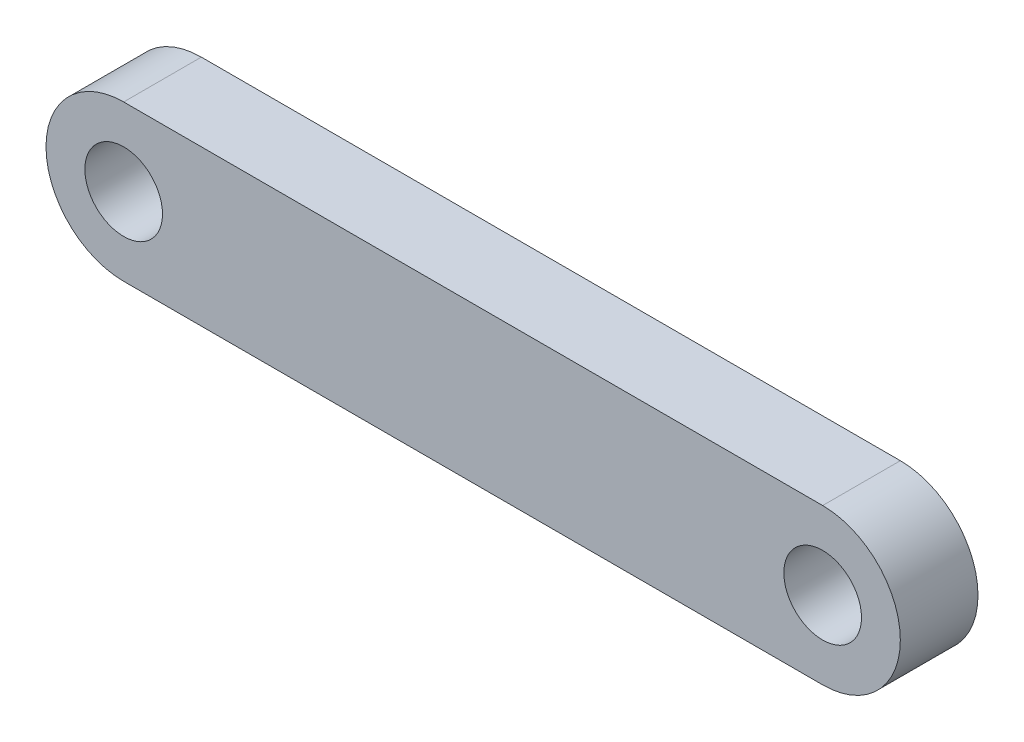
ISO-10303-21;
HEADER;
FILE_DESCRIPTION(('STEP AP214'),'2;1');
FILE_NAME('part.step','',(''),(''),'','','');
FILE_SCHEMA(('AUTOMOTIVE_DESIGN { 1 0 10303 214 1 1 1 1 }'));
ENDSEC;
DATA;
#1=APPLICATION_CONTEXT('core data for automotive mechanical design processes');
#2=APPLICATION_PROTOCOL_DEFINITION('international standard','automotive_design',2000,#1);
#3=PRODUCT_CONTEXT('',#1,'mechanical');
#4=PRODUCT('Part','Part','',(#3));
#5=PRODUCT_RELATED_PRODUCT_CATEGORY('part','',(#4));
#6=PRODUCT_DEFINITION_FORMATION('','',#4);
#7=PRODUCT_DEFINITION_CONTEXT('part definition',#1,'design');
#8=PRODUCT_DEFINITION('design','',#6,#7);
#9=PRODUCT_DEFINITION_SHAPE('','',#8);
#10=(LENGTH_UNIT() NAMED_UNIT(*) SI_UNIT(.MILLI.,.METRE.));
#11=(NAMED_UNIT(*) PLANE_ANGLE_UNIT() SI_UNIT($,.RADIAN.));
#12=(NAMED_UNIT(*) SI_UNIT($,.STERADIAN.) SOLID_ANGLE_UNIT());
#13=UNCERTAINTY_MEASURE_WITH_UNIT(LENGTH_MEASURE(1.E-05),#10,'distance_accuracy_value','');
#14=(GEOMETRIC_REPRESENTATION_CONTEXT(3) GLOBAL_UNCERTAINTY_ASSIGNED_CONTEXT((#13)) GLOBAL_UNIT_ASSIGNED_CONTEXT((#10,
#11,#12)) REPRESENTATION_CONTEXT('',''));
#15=CARTESIAN_POINT('',(0.,0.,0.));
#16=DIRECTION('',(0.,0.,1.));
#17=DIRECTION('',(1.,0.,0.));
#18=AXIS2_PLACEMENT_3D('',#15,#16,#17);
#19=CARTESIAN_POINT('',(-13.5,0.,3.));
#20=DIRECTION('',(0.,0.,1.));
#21=DIRECTION('',(1.,0.,0.));
#22=AXIS2_PLACEMENT_3D('',#19,#20,#21);
#23=PLANE('',#22);
#24=CARTESIAN_POINT('',(13.5,0.,3.));
#25=DIRECTION('',(0.,0.,1.));
#26=DIRECTION('',(1.,0.,0.));
#27=AXIS2_PLACEMENT_3D('',#24,#25,#26);
#28=CIRCLE('',#27,1.5);
#29=CARTESIAN_POINT('',(15.,0.,3.));
#30=VERTEX_POINT('',#29);
#31=EDGE_CURVE('E108',#30,#30,#28,.T.);
#32=ORIENTED_EDGE('',*,*,#31,.F.);
#33=EDGE_LOOP('',(#32));
#34=FACE_BOUND('',#33,.T.);
#35=CARTESIAN_POINT('',(-13.5,0.,3.));
#36=DIRECTION('',(0.,0.,1.));
#37=DIRECTION('',(1.,0.,0.));
#38=AXIS2_PLACEMENT_3D('',#35,#36,#37);
#39=CIRCLE('',#38,3.);
#40=CARTESIAN_POINT('',(-13.5,3.,3.));
#41=VERTEX_POINT('',#40);
#42=CARTESIAN_POINT('',(-13.5,-3.,3.));
#43=VERTEX_POINT('',#42);
#44=EDGE_CURVE('E93',#41,#43,#39,.T.);
#45=ORIENTED_EDGE('',*,*,#44,.T.);
#46=DIRECTION('',(1.,0.,0.));
#47=VECTOR('',#46,1.);
#48=CARTESIAN_POINT('',(-13.5,-3.,3.));
#49=LINE('',#48,#47);
#50=CARTESIAN_POINT('',(13.5,-3.,3.));
#51=VERTEX_POINT('',#50);
#52=EDGE_CURVE('E88',#43,#51,#49,.T.);
#53=ORIENTED_EDGE('',*,*,#52,.T.);
#54=CARTESIAN_POINT('',(13.5,0.,3.));
#55=DIRECTION('',(0.,0.,1.));
#56=DIRECTION('',(1.,0.,0.));
#57=AXIS2_PLACEMENT_3D('',#54,#55,#56);
#58=CIRCLE('',#57,3.);
#59=CARTESIAN_POINT('',(13.5,3.,3.));
#60=VERTEX_POINT('',#59);
#61=EDGE_CURVE('E91',#51,#60,#58,.T.);
#62=ORIENTED_EDGE('',*,*,#61,.T.);
#63=DIRECTION('',(-1.,0.,0.));
#64=VECTOR('',#63,1.);
#65=CARTESIAN_POINT('',(-13.5,3.,3.));
#66=LINE('',#65,#64);
#67=EDGE_CURVE('E58',#60,#41,#66,.T.);
#68=ORIENTED_EDGE('',*,*,#67,.T.);
#69=EDGE_LOOP('',(#45,#53,#62,#68));
#70=FACE_BOUND('',#69,.T.);
#71=CARTESIAN_POINT('',(-13.5,0.,3.));
#72=DIRECTION('',(0.,0.,1.));
#73=DIRECTION('',(1.,0.,0.));
#74=AXIS2_PLACEMENT_3D('',#71,#72,#73);
#75=CIRCLE('',#74,1.5);
#76=CARTESIAN_POINT('',(-12.,0.,3.));
#77=VERTEX_POINT('',#76);
#78=EDGE_CURVE('E123',#77,#77,#75,.T.);
#79=ORIENTED_EDGE('',*,*,#78,.F.);
#80=EDGE_LOOP('',(#79));
#81=FACE_BOUND('',#80,.T.);
#82=ADVANCED_FACE('F41',(#34,#70,#81),#23,.T.);
#83=CARTESIAN_POINT('',(-13.5,0.,0.));
#84=DIRECTION('',(0.,0.,1.));
#85=DIRECTION('',(1.,0.,0.));
#86=AXIS2_PLACEMENT_3D('',#83,#84,#85);
#87=PLANE('',#86);
#88=CARTESIAN_POINT('',(-13.5,0.,0.));
#89=DIRECTION('',(0.,0.,1.));
#90=DIRECTION('',(1.,0.,0.));
#91=AXIS2_PLACEMENT_3D('',#88,#89,#90);
#92=CIRCLE('',#91,3.);
#93=CARTESIAN_POINT('',(-13.5,3.,0.));
#94=VERTEX_POINT('',#93);
#95=CARTESIAN_POINT('',(-13.5,-3.,0.));
#96=VERTEX_POINT('',#95);
#97=EDGE_CURVE('E105',#94,#96,#92,.T.);
#98=ORIENTED_EDGE('',*,*,#97,.F.);
#99=DIRECTION('',(-1.,0.,0.));
#100=VECTOR('',#99,1.);
#101=CARTESIAN_POINT('',(-13.5,3.,0.));
#102=LINE('',#101,#100);
#103=CARTESIAN_POINT('',(13.5,3.,0.));
#104=VERTEX_POINT('',#103);
#105=EDGE_CURVE('E81',#104,#94,#102,.T.);
#106=ORIENTED_EDGE('',*,*,#105,.F.);
#107=CARTESIAN_POINT('',(13.5,0.,0.));
#108=DIRECTION('',(0.,0.,1.));
#109=DIRECTION('',(1.,0.,0.));
#110=AXIS2_PLACEMENT_3D('',#107,#108,#109);
#111=CIRCLE('',#110,3.);
#112=CARTESIAN_POINT('',(13.5,-3.,0.));
#113=VERTEX_POINT('',#112);
#114=EDGE_CURVE('E75',#113,#104,#111,.T.);
#115=ORIENTED_EDGE('',*,*,#114,.F.);
#116=DIRECTION('',(1.,0.,0.));
#117=VECTOR('',#116,1.);
#118=CARTESIAN_POINT('',(-13.5,-3.,0.));
#119=LINE('',#118,#117);
#120=EDGE_CURVE('E97',#96,#113,#119,.T.);
#121=ORIENTED_EDGE('',*,*,#120,.F.);
#122=EDGE_LOOP('',(#98,#106,#115,#121));
#123=FACE_BOUND('',#122,.T.);
#124=CARTESIAN_POINT('',(13.5,0.,0.));
#125=DIRECTION('',(0.,0.,1.));
#126=DIRECTION('',(1.,0.,0.));
#127=AXIS2_PLACEMENT_3D('',#124,#125,#126);
#128=CIRCLE('',#127,1.5);
#129=CARTESIAN_POINT('',(15.,0.,0.));
#130=VERTEX_POINT('',#129);
#131=EDGE_CURVE('E120',#130,#130,#128,.T.);
#132=ORIENTED_EDGE('',*,*,#131,.T.);
#133=EDGE_LOOP('',(#132));
#134=FACE_BOUND('',#133,.T.);
#135=CARTESIAN_POINT('',(-13.5,0.,0.));
#136=DIRECTION('',(0.,0.,1.));
#137=DIRECTION('',(1.,0.,0.));
#138=AXIS2_PLACEMENT_3D('',#135,#136,#137);
#139=CIRCLE('',#138,1.5);
#140=CARTESIAN_POINT('',(-12.,0.,0.));
#141=VERTEX_POINT('',#140);
#142=EDGE_CURVE('E126',#141,#141,#139,.T.);
#143=ORIENTED_EDGE('',*,*,#142,.T.);
#144=EDGE_LOOP('',(#143));
#145=FACE_BOUND('',#144,.T.);
#146=ADVANCED_FACE('F116',(#123,#134,#145),#87,.F.);
#147=CARTESIAN_POINT('',(-13.5,0.,3.));
#148=DIRECTION('',(0.,0.,-1.));
#149=DIRECTION('',(-1.,0.,0.));
#150=AXIS2_PLACEMENT_3D('',#147,#148,#149);
#151=CYLINDRICAL_SURFACE('',#150,3.);
#152=ORIENTED_EDGE('',*,*,#97,.T.);
#153=DIRECTION('',(0.,0.,-1.));
#154=VECTOR('',#153,1.);
#155=CARTESIAN_POINT('',(-13.5,-3.,3.));
#156=LINE('',#155,#154);
#157=EDGE_CURVE('E11',#43,#96,#156,.T.);
#158=ORIENTED_EDGE('',*,*,#157,.F.);
#159=ORIENTED_EDGE('',*,*,#44,.F.);
#160=DIRECTION('',(0.,0.,-1.));
#161=VECTOR('',#160,1.);
#162=CARTESIAN_POINT('',(-13.5,3.,3.));
#163=LINE('',#162,#161);
#164=EDGE_CURVE('E101',#41,#94,#163,.T.);
#165=ORIENTED_EDGE('',*,*,#164,.T.);
#166=EDGE_LOOP('',(#152,#158,#159,#165));
#167=FACE_BOUND('',#166,.T.);
#168=ADVANCED_FACE('F43',(#167),#151,.T.);
#169=CARTESIAN_POINT('',(-13.5,-3.,3.));
#170=DIRECTION('',(0.,1.,0.));
#171=DIRECTION('',(0.,0.,1.));
#172=AXIS2_PLACEMENT_3D('',#169,#170,#171);
#173=PLANE('',#172);
#174=ORIENTED_EDGE('',*,*,#120,.T.);
#175=DIRECTION('',(0.,0.,-1.));
#176=VECTOR('',#175,1.);
#177=CARTESIAN_POINT('',(13.5,-3.,3.));
#178=LINE('',#177,#176);
#179=EDGE_CURVE('E50',#51,#113,#178,.T.);
#180=ORIENTED_EDGE('',*,*,#179,.F.);
#181=ORIENTED_EDGE('',*,*,#52,.F.);
#182=ORIENTED_EDGE('',*,*,#157,.T.);
#183=EDGE_LOOP('',(#174,#180,#181,#182));
#184=FACE_BOUND('',#183,.T.);
#185=ADVANCED_FACE('F96',(#184),#173,.F.);
#186=CARTESIAN_POINT('',(13.5,0.,3.));
#187=DIRECTION('',(0.,0.,-1.));
#188=DIRECTION('',(-1.,0.,0.));
#189=AXIS2_PLACEMENT_3D('',#186,#187,#188);
#190=CYLINDRICAL_SURFACE('',#189,3.);
#191=ORIENTED_EDGE('',*,*,#114,.T.);
#192=DIRECTION('',(0.,0.,-1.));
#193=VECTOR('',#192,1.);
#194=CARTESIAN_POINT('',(13.5,3.,3.));
#195=LINE('',#194,#193);
#196=EDGE_CURVE('E98',#60,#104,#195,.T.);
#197=ORIENTED_EDGE('',*,*,#196,.F.);
#198=ORIENTED_EDGE('',*,*,#61,.F.);
#199=ORIENTED_EDGE('',*,*,#179,.T.);
#200=EDGE_LOOP('',(#191,#197,#198,#199));
#201=FACE_BOUND('',#200,.T.);
#202=ADVANCED_FACE('F99',(#201),#190,.T.);
#203=CARTESIAN_POINT('',(-13.5,3.,3.));
#204=DIRECTION('',(0.,-1.,0.));
#205=DIRECTION('',(0.,0.,-1.));
#206=AXIS2_PLACEMENT_3D('',#203,#204,#205);
#207=PLANE('',#206);
#208=ORIENTED_EDGE('',*,*,#105,.T.);
#209=ORIENTED_EDGE('',*,*,#164,.F.);
#210=ORIENTED_EDGE('',*,*,#67,.F.);
#211=ORIENTED_EDGE('',*,*,#196,.T.);
#212=EDGE_LOOP('',(#208,#209,#210,#211));
#213=FACE_BOUND('',#212,.T.);
#214=ADVANCED_FACE('F113',(#213),#207,.F.);
#215=CARTESIAN_POINT('',(13.5,0.,3.));
#216=DIRECTION('',(0.,0.,-1.));
#217=DIRECTION('',(-1.,0.,0.));
#218=AXIS2_PLACEMENT_3D('',#215,#216,#217);
#219=CYLINDRICAL_SURFACE('',#218,1.5);
#220=ORIENTED_EDGE('',*,*,#31,.T.);
#221=EDGE_LOOP('',(#220));
#222=FACE_BOUND('',#221,.T.);
#223=ORIENTED_EDGE('',*,*,#131,.F.);
#224=EDGE_LOOP('',(#223));
#225=FACE_BOUND('',#224,.T.);
#226=ADVANCED_FACE('F143',(#222,#225),#219,.F.);
#227=CARTESIAN_POINT('',(-13.5,0.,3.));
#228=DIRECTION('',(0.,0.,-1.));
#229=DIRECTION('',(-1.,0.,0.));
#230=AXIS2_PLACEMENT_3D('',#227,#228,#229);
#231=CYLINDRICAL_SURFACE('',#230,1.5);
#232=ORIENTED_EDGE('',*,*,#78,.T.);
#233=EDGE_LOOP('',(#232));
#234=FACE_BOUND('',#233,.T.);
#235=ORIENTED_EDGE('',*,*,#142,.F.);
#236=EDGE_LOOP('',(#235));
#237=FACE_BOUND('',#236,.T.);
#238=ADVANCED_FACE('F132',(#234,#237),#231,.F.);
#239=CLOSED_SHELL('',(#82,#146,#168,#185,#202,#214,#226,#238));
#240=MANIFOLD_SOLID_BREP('B2',#239);
#241=ADVANCED_BREP_SHAPE_REPRESENTATION('',(#18,#240),#14);
#242=SHAPE_DEFINITION_REPRESENTATION(#9,#241);
ENDSEC;
END-ISO-10303-21;
